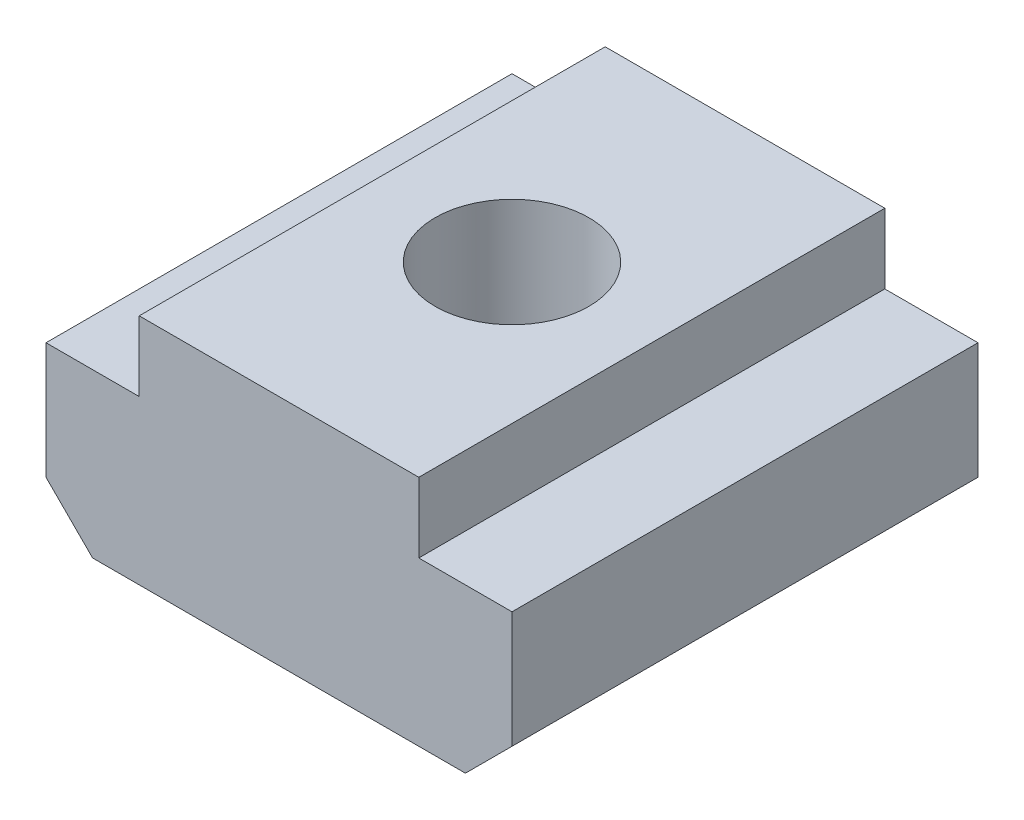
ISO-10303-21;
HEADER;
FILE_DESCRIPTION(('STEP AP214'),'2;1');
FILE_NAME('part.step','',(''),(''),'','','');
FILE_SCHEMA(('AUTOMOTIVE_DESIGN { 1 0 10303 214 1 1 1 1 }'));
ENDSEC;
DATA;
#1=APPLICATION_CONTEXT('core data for automotive mechanical design processes');
#2=APPLICATION_PROTOCOL_DEFINITION('international standard','automotive_design',2000,#1);
#3=PRODUCT_CONTEXT('',#1,'mechanical');
#4=PRODUCT('Part','Part','',(#3));
#5=PRODUCT_RELATED_PRODUCT_CATEGORY('part','',(#4));
#6=PRODUCT_DEFINITION_FORMATION('','',#4);
#7=PRODUCT_DEFINITION_CONTEXT('part definition',#1,'design');
#8=PRODUCT_DEFINITION('design','',#6,#7);
#9=PRODUCT_DEFINITION_SHAPE('','',#8);
#10=(LENGTH_UNIT() NAMED_UNIT(*) SI_UNIT(.MILLI.,.METRE.));
#11=(NAMED_UNIT(*) PLANE_ANGLE_UNIT() SI_UNIT($,.RADIAN.));
#12=(NAMED_UNIT(*) SI_UNIT($,.STERADIAN.) SOLID_ANGLE_UNIT());
#13=UNCERTAINTY_MEASURE_WITH_UNIT(LENGTH_MEASURE(1.E-05),#10,'distance_accuracy_value','');
#14=(GEOMETRIC_REPRESENTATION_CONTEXT(3) GLOBAL_UNCERTAINTY_ASSIGNED_CONTEXT((#13)) GLOBAL_UNIT_ASSIGNED_CONTEXT((#10,
#11,#12)) REPRESENTATION_CONTEXT('',''));
#15=CARTESIAN_POINT('',(0.,0.,0.));
#16=DIRECTION('',(0.,0.,1.));
#17=DIRECTION('',(1.,0.,0.));
#18=AXIS2_PLACEMENT_3D('',#15,#16,#17);
#19=CARTESIAN_POINT('',(-5.,1.,10.));
#20=DIRECTION('',(0.707106781186548,0.707106781186548,0.));
#21=DIRECTION('',(-0.707106781186548,0.707106781186548,0.));
#22=AXIS2_PLACEMENT_3D('',#19,#20,#21);
#23=PLANE('',#22);
#24=DIRECTION('',(0.707106781186548,-0.707106781186548,0.));
#25=VECTOR('',#24,1.);
#26=CARTESIAN_POINT('',(-5.,1.,0.));
#27=LINE('',#26,#25);
#28=CARTESIAN_POINT('',(-5.,1.,0.));
#29=VERTEX_POINT('',#28);
#30=CARTESIAN_POINT('',(-4.,0.,0.));
#31=VERTEX_POINT('',#30);
#32=EDGE_CURVE('E144',#29,#31,#27,.T.);
#33=ORIENTED_EDGE('',*,*,#32,.T.);
#34=DIRECTION('',(0.,0.,-1.));
#35=VECTOR('',#34,1.);
#36=CARTESIAN_POINT('',(-4.,0.,10.));
#37=LINE('',#36,#35);
#38=CARTESIAN_POINT('',(-4.,0.,10.));
#39=VERTEX_POINT('',#38);
#40=EDGE_CURVE('E11',#39,#31,#37,.T.);
#41=ORIENTED_EDGE('',*,*,#40,.F.);
#42=DIRECTION('',(0.707106781186548,-0.707106781186548,0.));
#43=VECTOR('',#42,1.);
#44=CARTESIAN_POINT('',(-5.,1.,10.));
#45=LINE('',#44,#43);
#46=CARTESIAN_POINT('',(-5.,1.,10.));
#47=VERTEX_POINT('',#46);
#48=EDGE_CURVE('E163',#47,#39,#45,.T.);
#49=ORIENTED_EDGE('',*,*,#48,.F.);
#50=DIRECTION('',(0.,0.,-1.));
#51=VECTOR('',#50,1.);
#52=CARTESIAN_POINT('',(-5.,1.,10.));
#53=LINE('',#52,#51);
#54=EDGE_CURVE('E140',#47,#29,#53,.T.);
#55=ORIENTED_EDGE('',*,*,#54,.T.);
#56=EDGE_LOOP('',(#33,#41,#49,#55));
#57=FACE_BOUND('',#56,.T.);
#58=ADVANCED_FACE('F36',(#57),#23,.F.);
#59=CARTESIAN_POINT('',(-4.,0.,10.));
#60=DIRECTION('',(0.,1.,0.));
#61=DIRECTION('',(0.,0.,1.));
#62=AXIS2_PLACEMENT_3D('',#59,#60,#61);
#63=PLANE('',#62);
#64=CARTESIAN_POINT('',(0.,0.,5.));
#65=DIRECTION('',(0.,1.,0.));
#66=DIRECTION('',(0.,0.,1.));
#67=AXIS2_PLACEMENT_3D('',#64,#65,#66);
#68=CIRCLE('',#67,1.65);
#69=CARTESIAN_POINT('',(0.,0.,6.65));
#70=VERTEX_POINT('',#69);
#71=EDGE_CURVE('E148',#70,#70,#68,.T.);
#72=ORIENTED_EDGE('',*,*,#71,.T.);
#73=EDGE_LOOP('',(#72));
#74=FACE_BOUND('',#73,.T.);
#75=DIRECTION('',(1.,0.,0.));
#76=VECTOR('',#75,1.);
#77=CARTESIAN_POINT('',(-4.,0.,0.));
#78=LINE('',#77,#76);
#79=CARTESIAN_POINT('',(4.,0.,0.));
#80=VERTEX_POINT('',#79);
#81=EDGE_CURVE('E147',#31,#80,#78,.T.);
#82=ORIENTED_EDGE('',*,*,#81,.T.);
#83=DIRECTION('',(0.,0.,-1.));
#84=VECTOR('',#83,1.);
#85=CARTESIAN_POINT('',(4.,0.,10.));
#86=LINE('',#85,#84);
#87=CARTESIAN_POINT('',(4.,0.,10.));
#88=VERTEX_POINT('',#87);
#89=EDGE_CURVE('E44',#88,#80,#86,.T.);
#90=ORIENTED_EDGE('',*,*,#89,.F.);
#91=DIRECTION('',(1.,0.,0.));
#92=VECTOR('',#91,1.);
#93=CARTESIAN_POINT('',(-4.,0.,10.));
#94=LINE('',#93,#92);
#95=EDGE_CURVE('E101',#39,#88,#94,.T.);
#96=ORIENTED_EDGE('',*,*,#95,.F.);
#97=ORIENTED_EDGE('',*,*,#40,.T.);
#98=EDGE_LOOP('',(#82,#90,#96,#97));
#99=FACE_BOUND('',#98,.T.);
#100=ADVANCED_FACE('F239',(#74,#99),#63,.F.);
#101=CARTESIAN_POINT('',(4.,0.,10.));
#102=DIRECTION('',(-0.707106781186548,0.707106781186548,0.));
#103=DIRECTION('',(-0.707106781186548,-0.707106781186548,0.));
#104=AXIS2_PLACEMENT_3D('',#101,#102,#103);
#105=PLANE('',#104);
#106=DIRECTION('',(0.707106781186548,0.707106781186548,0.));
#107=VECTOR('',#106,1.);
#108=CARTESIAN_POINT('',(4.,0.,0.));
#109=LINE('',#108,#107);
#110=CARTESIAN_POINT('',(5.,1.,0.));
#111=VERTEX_POINT('',#110);
#112=EDGE_CURVE('E150',#80,#111,#109,.T.);
#113=ORIENTED_EDGE('',*,*,#112,.T.);
#114=DIRECTION('',(0.,0.,-1.));
#115=VECTOR('',#114,1.);
#116=CARTESIAN_POINT('',(5.,1.,10.));
#117=LINE('',#116,#115);
#118=CARTESIAN_POINT('',(5.,1.,10.));
#119=VERTEX_POINT('',#118);
#120=EDGE_CURVE('E176',#119,#111,#117,.T.);
#121=ORIENTED_EDGE('',*,*,#120,.F.);
#122=DIRECTION('',(0.707106781186548,0.707106781186548,0.));
#123=VECTOR('',#122,1.);
#124=CARTESIAN_POINT('',(4.,0.,10.));
#125=LINE('',#124,#123);
#126=EDGE_CURVE('E184',#88,#119,#125,.T.);
#127=ORIENTED_EDGE('',*,*,#126,.F.);
#128=ORIENTED_EDGE('',*,*,#89,.T.);
#129=EDGE_LOOP('',(#113,#121,#127,#128));
#130=FACE_BOUND('',#129,.T.);
#131=ADVANCED_FACE('F182',(#130),#105,.F.);
#132=CARTESIAN_POINT('',(5.,1.,10.));
#133=DIRECTION('',(-1.,0.,0.));
#134=DIRECTION('',(0.,0.,1.));
#135=AXIS2_PLACEMENT_3D('',#132,#133,#134);
#136=PLANE('',#135);
#137=DIRECTION('',(0.,1.,0.));
#138=VECTOR('',#137,1.);
#139=CARTESIAN_POINT('',(5.,1.,0.));
#140=LINE('',#139,#138);
#141=CARTESIAN_POINT('',(5.,3.5,0.));
#142=VERTEX_POINT('',#141);
#143=EDGE_CURVE('E152',#111,#142,#140,.T.);
#144=ORIENTED_EDGE('',*,*,#143,.T.);
#145=DIRECTION('',(0.,0.,-1.));
#146=VECTOR('',#145,1.);
#147=CARTESIAN_POINT('',(5.,3.5,10.));
#148=LINE('',#147,#146);
#149=CARTESIAN_POINT('',(5.,3.5,10.));
#150=VERTEX_POINT('',#149);
#151=EDGE_CURVE('E173',#150,#142,#148,.T.);
#152=ORIENTED_EDGE('',*,*,#151,.F.);
#153=DIRECTION('',(0.,1.,0.));
#154=VECTOR('',#153,1.);
#155=CARTESIAN_POINT('',(5.,1.,10.));
#156=LINE('',#155,#154);
#157=EDGE_CURVE('E202',#119,#150,#156,.T.);
#158=ORIENTED_EDGE('',*,*,#157,.F.);
#159=ORIENTED_EDGE('',*,*,#120,.T.);
#160=EDGE_LOOP('',(#144,#152,#158,#159));
#161=FACE_BOUND('',#160,.T.);
#162=ADVANCED_FACE('F193',(#161),#136,.F.);
#163=CARTESIAN_POINT('',(5.,3.5,10.));
#164=DIRECTION('',(0.,-1.,0.));
#165=DIRECTION('',(1.,0.,0.));
#166=AXIS2_PLACEMENT_3D('',#163,#164,#165);
#167=PLANE('',#166);
#168=DIRECTION('',(-1.,0.,0.));
#169=VECTOR('',#168,1.);
#170=CARTESIAN_POINT('',(5.,3.5,0.));
#171=LINE('',#170,#169);
#172=CARTESIAN_POINT('',(3.,3.5,0.));
#173=VERTEX_POINT('',#172);
#174=EDGE_CURVE('E154',#142,#173,#171,.T.);
#175=ORIENTED_EDGE('',*,*,#174,.T.);
#176=DIRECTION('',(0.,0.,-1.));
#177=VECTOR('',#176,1.);
#178=CARTESIAN_POINT('',(3.,3.5,10.));
#179=LINE('',#178,#177);
#180=CARTESIAN_POINT('',(3.,3.5,10.));
#181=VERTEX_POINT('',#180);
#182=EDGE_CURVE('E170',#181,#173,#179,.T.);
#183=ORIENTED_EDGE('',*,*,#182,.F.);
#184=DIRECTION('',(-1.,0.,0.));
#185=VECTOR('',#184,1.);
#186=CARTESIAN_POINT('',(5.,3.5,10.));
#187=LINE('',#186,#185);
#188=EDGE_CURVE('E199',#150,#181,#187,.T.);
#189=ORIENTED_EDGE('',*,*,#188,.F.);
#190=ORIENTED_EDGE('',*,*,#151,.T.);
#191=EDGE_LOOP('',(#175,#183,#189,#190));
#192=FACE_BOUND('',#191,.T.);
#193=ADVANCED_FACE('F197',(#192),#167,.F.);
#194=CARTESIAN_POINT('',(3.,3.5,10.));
#195=DIRECTION('',(-1.,0.,0.));
#196=DIRECTION('',(0.,-1.,0.));
#197=AXIS2_PLACEMENT_3D('',#194,#195,#196);
#198=PLANE('',#197);
#199=DIRECTION('',(0.,1.,0.));
#200=VECTOR('',#199,1.);
#201=CARTESIAN_POINT('',(3.,3.5,0.));
#202=LINE('',#201,#200);
#203=CARTESIAN_POINT('',(3.,5.,0.));
#204=VERTEX_POINT('',#203);
#205=EDGE_CURVE('E156',#173,#204,#202,.T.);
#206=ORIENTED_EDGE('',*,*,#205,.T.);
#207=DIRECTION('',(0.,0.,-1.));
#208=VECTOR('',#207,1.);
#209=CARTESIAN_POINT('',(3.,5.,10.));
#210=LINE('',#209,#208);
#211=CARTESIAN_POINT('',(3.,5.,10.));
#212=VERTEX_POINT('',#211);
#213=EDGE_CURVE('E167',#212,#204,#210,.T.);
#214=ORIENTED_EDGE('',*,*,#213,.F.);
#215=DIRECTION('',(0.,1.,0.));
#216=VECTOR('',#215,1.);
#217=CARTESIAN_POINT('',(3.,3.5,10.));
#218=LINE('',#217,#216);
#219=EDGE_CURVE('E201',#181,#212,#218,.T.);
#220=ORIENTED_EDGE('',*,*,#219,.F.);
#221=ORIENTED_EDGE('',*,*,#182,.T.);
#222=EDGE_LOOP('',(#206,#214,#220,#221));
#223=FACE_BOUND('',#222,.T.);
#224=ADVANCED_FACE('F221',(#223),#198,.F.);
#225=CARTESIAN_POINT('',(3.,5.,10.));
#226=DIRECTION('',(0.,-1.,0.));
#227=DIRECTION('',(0.,0.,-1.));
#228=AXIS2_PLACEMENT_3D('',#225,#226,#227);
#229=PLANE('',#228);
#230=CARTESIAN_POINT('',(0.,5.,5.));
#231=DIRECTION('',(0.,1.,0.));
#232=DIRECTION('',(0.,0.,1.));
#233=AXIS2_PLACEMENT_3D('',#230,#231,#232);
#234=CIRCLE('',#233,1.65);
#235=CARTESIAN_POINT('',(0.,5.,6.65));
#236=VERTEX_POINT('',#235);
#237=EDGE_CURVE('E212',#236,#236,#234,.T.);
#238=ORIENTED_EDGE('',*,*,#237,.F.);
#239=EDGE_LOOP('',(#238));
#240=FACE_BOUND('',#239,.T.);
#241=DIRECTION('',(-1.,0.,0.));
#242=VECTOR('',#241,1.);
#243=CARTESIAN_POINT('',(3.,5.,0.));
#244=LINE('',#243,#242);
#245=CARTESIAN_POINT('',(-3.,5.,0.));
#246=VERTEX_POINT('',#245);
#247=EDGE_CURVE('E158',#204,#246,#244,.T.);
#248=ORIENTED_EDGE('',*,*,#247,.T.);
#249=DIRECTION('',(0.,0.,-1.));
#250=VECTOR('',#249,1.);
#251=CARTESIAN_POINT('',(-3.,5.,10.));
#252=LINE('',#251,#250);
#253=CARTESIAN_POINT('',(-3.,5.,10.));
#254=VERTEX_POINT('',#253);
#255=EDGE_CURVE('E135',#254,#246,#252,.T.);
#256=ORIENTED_EDGE('',*,*,#255,.F.);
#257=DIRECTION('',(-1.,0.,0.));
#258=VECTOR('',#257,1.);
#259=CARTESIAN_POINT('',(3.,5.,10.));
#260=LINE('',#259,#258);
#261=EDGE_CURVE('E126',#212,#254,#260,.T.);
#262=ORIENTED_EDGE('',*,*,#261,.F.);
#263=ORIENTED_EDGE('',*,*,#213,.T.);
#264=EDGE_LOOP('',(#248,#256,#262,#263));
#265=FACE_BOUND('',#264,.T.);
#266=ADVANCED_FACE('F218',(#240,#265),#229,.F.);
#267=CARTESIAN_POINT('',(-3.,5.,10.));
#268=DIRECTION('',(1.,0.,0.));
#269=DIRECTION('',(0.,1.,0.));
#270=AXIS2_PLACEMENT_3D('',#267,#268,#269);
#271=PLANE('',#270);
#272=DIRECTION('',(0.,-1.,0.));
#273=VECTOR('',#272,1.);
#274=CARTESIAN_POINT('',(-3.,5.,0.));
#275=LINE('',#274,#273);
#276=CARTESIAN_POINT('',(-3.,3.5,0.));
#277=VERTEX_POINT('',#276);
#278=EDGE_CURVE('E134',#246,#277,#275,.T.);
#279=ORIENTED_EDGE('',*,*,#278,.T.);
#280=DIRECTION('',(0.,0.,-1.));
#281=VECTOR('',#280,1.);
#282=CARTESIAN_POINT('',(-3.,3.5,10.));
#283=LINE('',#282,#281);
#284=CARTESIAN_POINT('',(-3.,3.5,10.));
#285=VERTEX_POINT('',#284);
#286=EDGE_CURVE('E131',#285,#277,#283,.T.);
#287=ORIENTED_EDGE('',*,*,#286,.F.);
#288=DIRECTION('',(0.,-1.,0.));
#289=VECTOR('',#288,1.);
#290=CARTESIAN_POINT('',(-3.,5.,10.));
#291=LINE('',#290,#289);
#292=EDGE_CURVE('E120',#254,#285,#291,.T.);
#293=ORIENTED_EDGE('',*,*,#292,.F.);
#294=ORIENTED_EDGE('',*,*,#255,.T.);
#295=EDGE_LOOP('',(#279,#287,#293,#294));
#296=FACE_BOUND('',#295,.T.);
#297=ADVANCED_FACE('F132',(#296),#271,.F.);
#298=CARTESIAN_POINT('',(-3.,3.5,10.));
#299=DIRECTION('',(0.,-1.,0.));
#300=DIRECTION('',(0.,0.,-1.));
#301=AXIS2_PLACEMENT_3D('',#298,#299,#300);
#302=PLANE('',#301);
#303=DIRECTION('',(-1.,0.,0.));
#304=VECTOR('',#303,1.);
#305=CARTESIAN_POINT('',(-3.,3.5,0.));
#306=LINE('',#305,#304);
#307=CARTESIAN_POINT('',(-5.,3.5,0.));
#308=VERTEX_POINT('',#307);
#309=EDGE_CURVE('E87',#277,#308,#306,.T.);
#310=ORIENTED_EDGE('',*,*,#309,.T.);
#311=DIRECTION('',(0.,0.,-1.));
#312=VECTOR('',#311,1.);
#313=CARTESIAN_POINT('',(-5.,3.5,10.));
#314=LINE('',#313,#312);
#315=CARTESIAN_POINT('',(-5.,3.5,10.));
#316=VERTEX_POINT('',#315);
#317=EDGE_CURVE('E136',#316,#308,#314,.T.);
#318=ORIENTED_EDGE('',*,*,#317,.F.);
#319=DIRECTION('',(-1.,0.,0.));
#320=VECTOR('',#319,1.);
#321=CARTESIAN_POINT('',(-3.,3.5,10.));
#322=LINE('',#321,#320);
#323=EDGE_CURVE('E124',#285,#316,#322,.T.);
#324=ORIENTED_EDGE('',*,*,#323,.F.);
#325=ORIENTED_EDGE('',*,*,#286,.T.);
#326=EDGE_LOOP('',(#310,#318,#324,#325));
#327=FACE_BOUND('',#326,.T.);
#328=ADVANCED_FACE('F138',(#327),#302,.F.);
#329=CARTESIAN_POINT('',(-5.,3.5,10.));
#330=DIRECTION('',(1.,0.,0.));
#331=DIRECTION('',(0.,1.,0.));
#332=AXIS2_PLACEMENT_3D('',#329,#330,#331);
#333=PLANE('',#332);
#334=DIRECTION('',(0.,-1.,0.));
#335=VECTOR('',#334,1.);
#336=CARTESIAN_POINT('',(-5.,3.5,0.));
#337=LINE('',#336,#335);
#338=EDGE_CURVE('E93',#308,#29,#337,.T.);
#339=ORIENTED_EDGE('',*,*,#338,.T.);
#340=ORIENTED_EDGE('',*,*,#54,.F.);
#341=DIRECTION('',(0.,-1.,0.));
#342=VECTOR('',#341,1.);
#343=CARTESIAN_POINT('',(-5.,3.5,10.));
#344=LINE('',#343,#342);
#345=EDGE_CURVE('E52',#316,#47,#344,.T.);
#346=ORIENTED_EDGE('',*,*,#345,.F.);
#347=ORIENTED_EDGE('',*,*,#317,.T.);
#348=EDGE_LOOP('',(#339,#340,#346,#347));
#349=FACE_BOUND('',#348,.T.);
#350=ADVANCED_FACE('F228',(#349),#333,.F.);
#351=CARTESIAN_POINT('',(0.,0.,10.));
#352=DIRECTION('',(0.,0.,1.));
#353=DIRECTION('',(1.,0.,0.));
#354=AXIS2_PLACEMENT_3D('',#351,#352,#353);
#355=PLANE('',#354);
#356=ORIENTED_EDGE('',*,*,#48,.T.);
#357=ORIENTED_EDGE('',*,*,#95,.T.);
#358=ORIENTED_EDGE('',*,*,#126,.T.);
#359=ORIENTED_EDGE('',*,*,#157,.T.);
#360=ORIENTED_EDGE('',*,*,#188,.T.);
#361=ORIENTED_EDGE('',*,*,#219,.T.);
#362=ORIENTED_EDGE('',*,*,#261,.T.);
#363=ORIENTED_EDGE('',*,*,#292,.T.);
#364=ORIENTED_EDGE('',*,*,#323,.T.);
#365=ORIENTED_EDGE('',*,*,#345,.T.);
#366=EDGE_LOOP('',(#356,#357,#358,#359,#360,#361,#362,#363,#364,#365));
#367=FACE_BOUND('',#366,.T.);
#368=ADVANCED_FACE('F122',(#367),#355,.T.);
#369=CARTESIAN_POINT('',(0.,0.,0.));
#370=DIRECTION('',(0.,0.,1.));
#371=DIRECTION('',(1.,0.,0.));
#372=AXIS2_PLACEMENT_3D('',#369,#370,#371);
#373=PLANE('',#372);
#374=ORIENTED_EDGE('',*,*,#32,.F.);
#375=ORIENTED_EDGE('',*,*,#338,.F.);
#376=ORIENTED_EDGE('',*,*,#309,.F.);
#377=ORIENTED_EDGE('',*,*,#278,.F.);
#378=ORIENTED_EDGE('',*,*,#247,.F.);
#379=ORIENTED_EDGE('',*,*,#205,.F.);
#380=ORIENTED_EDGE('',*,*,#174,.F.);
#381=ORIENTED_EDGE('',*,*,#143,.F.);
#382=ORIENTED_EDGE('',*,*,#112,.F.);
#383=ORIENTED_EDGE('',*,*,#81,.F.);
#384=EDGE_LOOP('',(#374,#375,#376,#377,#378,#379,#380,#381,#382,#383));
#385=FACE_BOUND('',#384,.T.);
#386=ADVANCED_FACE('F188',(#385),#373,.F.);
#387=CARTESIAN_POINT('',(0.,5.,5.));
#388=DIRECTION('',(0.,1.,0.));
#389=DIRECTION('',(0.,0.,1.));
#390=AXIS2_PLACEMENT_3D('',#387,#388,#389);
#391=CYLINDRICAL_SURFACE('',#390,1.65);
#392=ORIENTED_EDGE('',*,*,#71,.F.);
#393=EDGE_LOOP('',(#392));
#394=FACE_BOUND('',#393,.T.);
#395=ORIENTED_EDGE('',*,*,#237,.T.);
#396=EDGE_LOOP('',(#395));
#397=FACE_BOUND('',#396,.T.);
#398=ADVANCED_FACE('F216',(#394,#397),#391,.F.);
#399=CLOSED_SHELL('',(#58,#100,#131,#162,#193,#224,#266,#297,#328,#350,#368,#386,#398));
#400=MANIFOLD_SOLID_BREP('B2',#399);
#401=ADVANCED_BREP_SHAPE_REPRESENTATION('',(#18,#400),#14);
#402=SHAPE_DEFINITION_REPRESENTATION(#9,#401);
ENDSEC;
END-ISO-10303-21;
